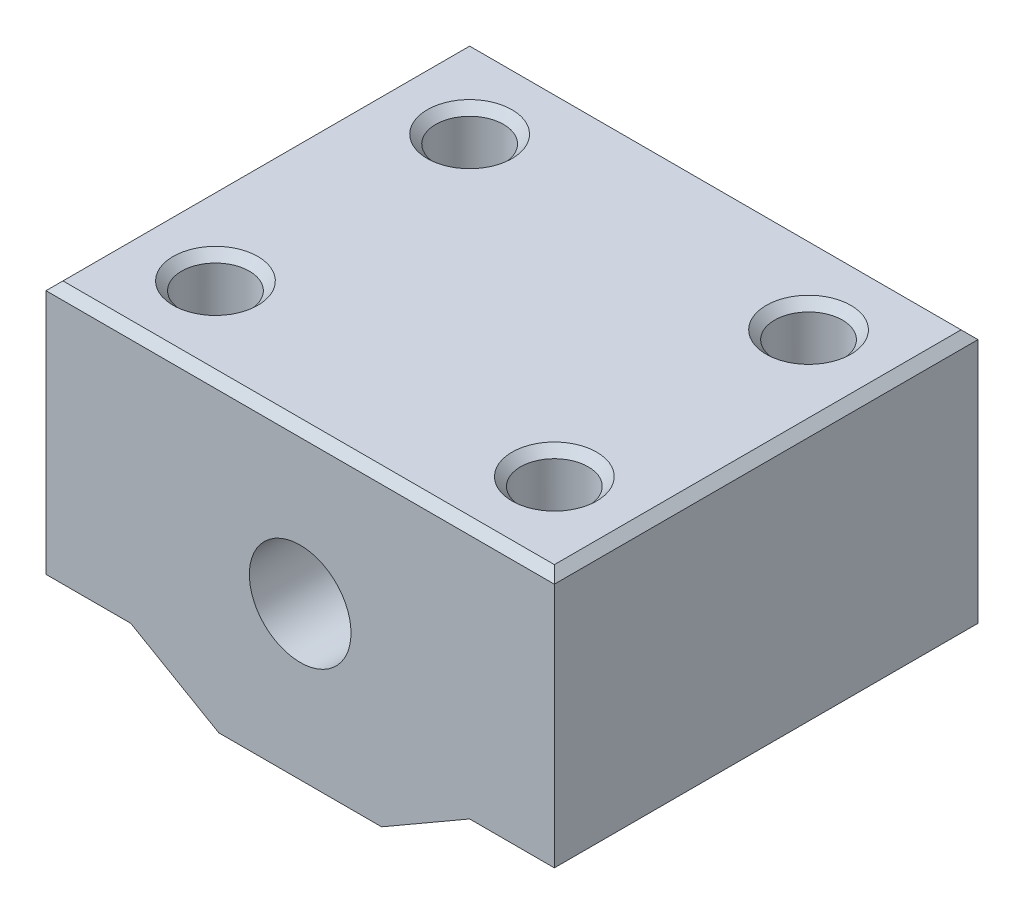
ISO-10303-21;
HEADER;
FILE_DESCRIPTION(('STEP AP214'),'2;1');
FILE_NAME('part.step','',(''),(''),'','','');
FILE_SCHEMA(('AUTOMOTIVE_DESIGN { 1 0 10303 214 1 1 1 1 }'));
ENDSEC;
DATA;
#1=APPLICATION_CONTEXT('core data for automotive mechanical design processes');
#2=APPLICATION_PROTOCOL_DEFINITION('international standard','automotive_design',2000,#1);
#3=PRODUCT_CONTEXT('',#1,'mechanical');
#4=PRODUCT('Part','Part','',(#3));
#5=PRODUCT_RELATED_PRODUCT_CATEGORY('part','',(#4));
#6=PRODUCT_DEFINITION_FORMATION('','',#4);
#7=PRODUCT_DEFINITION_CONTEXT('part definition',#1,'design');
#8=PRODUCT_DEFINITION('design','',#6,#7);
#9=PRODUCT_DEFINITION_SHAPE('','',#8);
#10=(LENGTH_UNIT() NAMED_UNIT(*) SI_UNIT(.MILLI.,.METRE.));
#11=(NAMED_UNIT(*) PLANE_ANGLE_UNIT() SI_UNIT($,.RADIAN.));
#12=(NAMED_UNIT(*) SI_UNIT($,.STERADIAN.) SOLID_ANGLE_UNIT());
#13=UNCERTAINTY_MEASURE_WITH_UNIT(LENGTH_MEASURE(1.E-05),#10,'distance_accuracy_value','');
#14=(GEOMETRIC_REPRESENTATION_CONTEXT(3) GLOBAL_UNCERTAINTY_ASSIGNED_CONTEXT((#13)) GLOBAL_UNIT_ASSIGNED_CONTEXT((#10,
#11,#12)) REPRESENTATION_CONTEXT('',''));
#15=CARTESIAN_POINT('',(0.,0.,0.));
#16=DIRECTION('',(0.,0.,1.));
#17=DIRECTION('',(1.,0.,0.));
#18=AXIS2_PLACEMENT_3D('',#15,#16,#17);
#19=CARTESIAN_POINT('',(15.,-7.5,25.));
#20=DIRECTION('',(-1.,0.,0.));
#21=DIRECTION('',(0.,0.,1.));
#22=AXIS2_PLACEMENT_3D('',#19,#20,#21);
#23=PLANE('',#22);
#24=DIRECTION('',(0.,1.,0.));
#25=VECTOR('',#24,1.);
#26=CARTESIAN_POINT('',(15.,-7.5,0.));
#27=LINE('',#26,#25);
#28=CARTESIAN_POINT('',(15.,-7.5,0.));
#29=VERTEX_POINT('',#28);
#30=CARTESIAN_POINT('',(15.,7.,0.));
#31=VERTEX_POINT('',#30);
#32=EDGE_CURVE('E248',#29,#31,#27,.T.);
#33=ORIENTED_EDGE('',*,*,#32,.T.);
#34=DIRECTION('',(0.,0.,1.));
#35=VECTOR('',#34,1.);
#36=CARTESIAN_POINT('',(15.,7.,25.));
#37=LINE('',#36,#35);
#38=CARTESIAN_POINT('',(15.,7.,25.));
#39=VERTEX_POINT('',#38);
#40=EDGE_CURVE('E205',#31,#39,#37,.T.);
#41=ORIENTED_EDGE('',*,*,#40,.T.);
#42=DIRECTION('',(0.,1.,0.));
#43=VECTOR('',#42,1.);
#44=CARTESIAN_POINT('',(15.,-7.5,25.));
#45=LINE('',#44,#43);
#46=CARTESIAN_POINT('',(15.,-7.5,25.));
#47=VERTEX_POINT('',#46);
#48=EDGE_CURVE('E249',#47,#39,#45,.T.);
#49=ORIENTED_EDGE('',*,*,#48,.F.);
#50=DIRECTION('',(0.,0.,-1.));
#51=VECTOR('',#50,1.);
#52=CARTESIAN_POINT('',(15.,-7.5,25.));
#53=LINE('',#52,#51);
#54=EDGE_CURVE('E161',#47,#29,#53,.T.);
#55=ORIENTED_EDGE('',*,*,#54,.T.);
#56=EDGE_LOOP('',(#33,#41,#49,#55));
#57=FACE_BOUND('',#56,.T.);
#58=ADVANCED_FACE('F32',(#57),#23,.F.);
#59=CARTESIAN_POINT('',(-15.,7.5,25.));
#60=DIRECTION('',(0.,-1.,0.));
#61=DIRECTION('',(0.,0.,-1.));
#62=AXIS2_PLACEMENT_3D('',#59,#60,#61);
#63=PLANE('',#62);
#64=DIRECTION('',(1.,0.,0.));
#65=VECTOR('',#64,1.);
#66=CARTESIAN_POINT('',(-15.,7.5,24.5));
#67=LINE('',#66,#65);
#68=CARTESIAN_POINT('',(-14.5,7.5,24.5));
#69=VERTEX_POINT('',#68);
#70=CARTESIAN_POINT('',(14.5,7.5,24.5));
#71=VERTEX_POINT('',#70);
#72=EDGE_CURVE('E200',#69,#71,#67,.T.);
#73=ORIENTED_EDGE('',*,*,#72,.T.);
#74=DIRECTION('',(0.,0.,-1.));
#75=VECTOR('',#74,1.);
#76=CARTESIAN_POINT('',(14.5,7.5,25.));
#77=LINE('',#76,#75);
#78=CARTESIAN_POINT('',(14.5,7.5,0.500000000000004));
#79=VERTEX_POINT('',#78);
#80=EDGE_CURVE('E202',#71,#79,#77,.T.);
#81=ORIENTED_EDGE('',*,*,#80,.T.);
#82=DIRECTION('',(-1.,0.,0.));
#83=VECTOR('',#82,1.);
#84=CARTESIAN_POINT('',(-15.,7.5,0.500000000000004));
#85=LINE('',#84,#83);
#86=CARTESIAN_POINT('',(-14.5,7.5,0.500000000000004));
#87=VERTEX_POINT('',#86);
#88=EDGE_CURVE('E196',#79,#87,#85,.T.);
#89=ORIENTED_EDGE('',*,*,#88,.T.);
#90=DIRECTION('',(0.,0.,1.));
#91=VECTOR('',#90,1.);
#92=CARTESIAN_POINT('',(-14.5,7.5,25.));
#93=LINE('',#92,#91);
#94=EDGE_CURVE('E198',#87,#69,#93,.T.);
#95=ORIENTED_EDGE('',*,*,#94,.T.);
#96=EDGE_LOOP('',(#73,#81,#89,#95));
#97=FACE_BOUND('',#96,.T.);
#98=CARTESIAN_POINT('',(-10.,7.5,5.));
#99=DIRECTION('',(0.,-1.,0.));
#100=DIRECTION('',(0.,0.,-1.));
#101=AXIS2_PLACEMENT_3D('',#98,#99,#100);
#102=CIRCLE('',#101,2.5);
#103=CARTESIAN_POINT('',(-10.,7.5,2.50000000000001));
#104=VERTEX_POINT('',#103);
#105=EDGE_CURVE('E193',#104,#104,#102,.T.);
#106=ORIENTED_EDGE('',*,*,#105,.T.);
#107=EDGE_LOOP('',(#106));
#108=FACE_BOUND('',#107,.T.);
#109=CARTESIAN_POINT('',(-10.,7.5,20.));
#110=DIRECTION('',(0.,-1.,0.));
#111=DIRECTION('',(0.,0.,-1.));
#112=AXIS2_PLACEMENT_3D('',#109,#110,#111);
#113=CIRCLE('',#112,2.50000000000001);
#114=CARTESIAN_POINT('',(-10.,7.5,17.5));
#115=VERTEX_POINT('',#114);
#116=EDGE_CURVE('E190',#115,#115,#113,.T.);
#117=ORIENTED_EDGE('',*,*,#116,.T.);
#118=EDGE_LOOP('',(#117));
#119=FACE_BOUND('',#118,.T.);
#120=CARTESIAN_POINT('',(10.,7.5,20.));
#121=DIRECTION('',(0.,-1.,0.));
#122=DIRECTION('',(0.,0.,-1.));
#123=AXIS2_PLACEMENT_3D('',#120,#121,#122);
#124=CIRCLE('',#123,2.5);
#125=CARTESIAN_POINT('',(10.,7.5,17.5));
#126=VERTEX_POINT('',#125);
#127=EDGE_CURVE('E187',#126,#126,#124,.T.);
#128=ORIENTED_EDGE('',*,*,#127,.T.);
#129=EDGE_LOOP('',(#128));
#130=FACE_BOUND('',#129,.T.);
#131=CARTESIAN_POINT('',(10.,7.5,5.));
#132=DIRECTION('',(0.,-1.,0.));
#133=DIRECTION('',(0.,0.,-1.));
#134=AXIS2_PLACEMENT_3D('',#131,#132,#133);
#135=CIRCLE('',#134,2.5);
#136=CARTESIAN_POINT('',(10.,7.5,2.5));
#137=VERTEX_POINT('',#136);
#138=EDGE_CURVE('E142',#137,#137,#135,.T.);
#139=ORIENTED_EDGE('',*,*,#138,.T.);
#140=EDGE_LOOP('',(#139));
#141=FACE_BOUND('',#140,.T.);
#142=ADVANCED_FACE('F314',(#97,#108,#119,#130,#141),#63,.F.);
#143=CARTESIAN_POINT('',(-15.,-7.5,25.));
#144=DIRECTION('',(1.,0.,0.));
#145=DIRECTION('',(0.,0.,-1.));
#146=AXIS2_PLACEMENT_3D('',#143,#144,#145);
#147=PLANE('',#146);
#148=DIRECTION('',(0.,-1.,0.));
#149=VECTOR('',#148,1.);
#150=CARTESIAN_POINT('',(-15.,-7.5,25.));
#151=LINE('',#150,#149);
#152=CARTESIAN_POINT('',(-15.,7.,25.));
#153=VERTEX_POINT('',#152);
#154=CARTESIAN_POINT('',(-15.,-7.5,25.));
#155=VERTEX_POINT('',#154);
#156=EDGE_CURVE('E251',#153,#155,#151,.T.);
#157=ORIENTED_EDGE('',*,*,#156,.F.);
#158=DIRECTION('',(0.,0.,-1.));
#159=VECTOR('',#158,1.);
#160=CARTESIAN_POINT('',(-15.,7.,25.));
#161=LINE('',#160,#159);
#162=CARTESIAN_POINT('',(-15.,7.,0.));
#163=VERTEX_POINT('',#162);
#164=EDGE_CURVE('E49',#153,#163,#161,.T.);
#165=ORIENTED_EDGE('',*,*,#164,.T.);
#166=DIRECTION('',(0.,-1.,0.));
#167=VECTOR('',#166,1.);
#168=CARTESIAN_POINT('',(-15.,-7.5,0.));
#169=LINE('',#168,#167);
#170=CARTESIAN_POINT('',(-15.,-7.5,0.));
#171=VERTEX_POINT('',#170);
#172=EDGE_CURVE('E266',#163,#171,#169,.T.);
#173=ORIENTED_EDGE('',*,*,#172,.T.);
#174=DIRECTION('',(0.,0.,-1.));
#175=VECTOR('',#174,1.);
#176=CARTESIAN_POINT('',(-15.,-7.5,25.));
#177=LINE('',#176,#175);
#178=EDGE_CURVE('E174',#155,#171,#177,.T.);
#179=ORIENTED_EDGE('',*,*,#178,.F.);
#180=EDGE_LOOP('',(#157,#165,#173,#179));
#181=FACE_BOUND('',#180,.T.);
#182=ADVANCED_FACE('F320',(#181),#147,.F.);
#183=CARTESIAN_POINT('',(-15.,-7.5,25.));
#184=DIRECTION('',(0.,1.,0.));
#185=DIRECTION('',(-1.,0.,0.));
#186=AXIS2_PLACEMENT_3D('',#183,#184,#185);
#187=PLANE('',#186);
#188=DIRECTION('',(0.,0.,-1.));
#189=VECTOR('',#188,1.);
#190=CARTESIAN_POINT('',(-10.,-7.5,25.));
#191=LINE('',#190,#189);
#192=CARTESIAN_POINT('',(-10.,-7.5,18.));
#193=VERTEX_POINT('',#192);
#194=CARTESIAN_POINT('',(-10.,-7.5,7.));
#195=VERTEX_POINT('',#194);
#196=EDGE_CURVE('E175',#193,#195,#191,.T.);
#197=ORIENTED_EDGE('',*,*,#196,.F.);
#198=CARTESIAN_POINT('',(-10.,-7.5,20.));
#199=DIRECTION('',(0.,1.,0.));
#200=DIRECTION('',(-1.,0.,0.));
#201=AXIS2_PLACEMENT_3D('',#198,#199,#200);
#202=CIRCLE('',#201,2.);
#203=CARTESIAN_POINT('',(-10.,-7.5,22.));
#204=VERTEX_POINT('',#203);
#205=EDGE_CURVE('E242',#193,#204,#202,.T.);
#206=ORIENTED_EDGE('',*,*,#205,.T.);
#207=CARTESIAN_POINT('',(-10.,-7.5,25.));
#208=VERTEX_POINT('',#207);
#209=EDGE_CURVE('E171',#208,#204,#191,.T.);
#210=ORIENTED_EDGE('',*,*,#209,.F.);
#211=DIRECTION('',(1.,0.,0.));
#212=VECTOR('',#211,1.);
#213=CARTESIAN_POINT('',(-15.,-7.5,25.));
#214=LINE('',#213,#212);
#215=EDGE_CURVE('E254',#155,#208,#214,.T.);
#216=ORIENTED_EDGE('',*,*,#215,.F.);
#217=ORIENTED_EDGE('',*,*,#178,.T.);
#218=DIRECTION('',(1.,0.,0.));
#219=VECTOR('',#218,1.);
#220=CARTESIAN_POINT('',(-15.,-7.5,0.));
#221=LINE('',#220,#219);
#222=CARTESIAN_POINT('',(-10.,-7.5,0.));
#223=VERTEX_POINT('',#222);
#224=EDGE_CURVE('E268',#171,#223,#221,.T.);
#225=ORIENTED_EDGE('',*,*,#224,.T.);
#226=CARTESIAN_POINT('',(-10.,-7.5,3.));
#227=VERTEX_POINT('',#226);
#228=EDGE_CURVE('E170',#227,#223,#191,.T.);
#229=ORIENTED_EDGE('',*,*,#228,.F.);
#230=CARTESIAN_POINT('',(-10.,-7.5,5.));
#231=DIRECTION('',(0.,1.,0.));
#232=DIRECTION('',(-1.,0.,0.));
#233=AXIS2_PLACEMENT_3D('',#230,#231,#232);
#234=CIRCLE('',#233,2.);
#235=EDGE_CURVE('E245',#227,#195,#234,.T.);
#236=ORIENTED_EDGE('',*,*,#235,.T.);
#237=EDGE_LOOP('',(#197,#206,#210,#216,#217,#225,#229,#236));
#238=FACE_BOUND('',#237,.T.);
#239=ADVANCED_FACE('F448',(#238),#187,.F.);
#240=CARTESIAN_POINT('',(-10.,-7.5,25.));
#241=DIRECTION('',(0.500000000000001,0.866025403784438,0.));
#242=DIRECTION('',(-0.866025403784438,0.500000000000001,0.));
#243=AXIS2_PLACEMENT_3D('',#240,#241,#242);
#244=PLANE('',#243);
#245=ORIENTED_EDGE('',*,*,#209,.T.);
#246=CARTESIAN_POINT('',(-10.,-7.5,20.));
#247=DIRECTION('',(0.500000000000001,0.866025403784438,0.));
#248=DIRECTION('',(-0.866025403784438,0.500000000000001,0.));
#249=AXIS2_PLACEMENT_3D('',#246,#247,#248);
#250=ELLIPSE('',#249,2.30940107675851,2.);
#251=EDGE_CURVE('E181',#204,#193,#250,.T.);
#252=ORIENTED_EDGE('',*,*,#251,.T.);
#253=ORIENTED_EDGE('',*,*,#196,.T.);
#254=CARTESIAN_POINT('',(-10.,-7.5,5.));
#255=DIRECTION('',(0.500000000000001,0.866025403784438,0.));
#256=DIRECTION('',(-0.866025403784438,0.500000000000001,0.));
#257=AXIS2_PLACEMENT_3D('',#254,#255,#256);
#258=ELLIPSE('',#257,2.3094010767585,2.);
#259=EDGE_CURVE('E178',#195,#227,#258,.T.);
#260=ORIENTED_EDGE('',*,*,#259,.T.);
#261=ORIENTED_EDGE('',*,*,#228,.T.);
#262=DIRECTION('',(0.866025403784438,-0.500000000000001,0.));
#263=VECTOR('',#262,1.);
#264=CARTESIAN_POINT('',(-10.,-7.5,0.));
#265=LINE('',#264,#263);
#266=CARTESIAN_POINT('',(-4.80384757729338,-10.5,0.));
#267=VERTEX_POINT('',#266);
#268=EDGE_CURVE('E271',#223,#267,#265,.T.);
#269=ORIENTED_EDGE('',*,*,#268,.T.);
#270=DIRECTION('',(0.,0.,-1.));
#271=VECTOR('',#270,1.);
#272=CARTESIAN_POINT('',(-4.80384757729338,-10.5,25.));
#273=LINE('',#272,#271);
#274=CARTESIAN_POINT('',(-4.80384757729338,-10.5,25.));
#275=VERTEX_POINT('',#274);
#276=EDGE_CURVE('E167',#275,#267,#273,.T.);
#277=ORIENTED_EDGE('',*,*,#276,.F.);
#278=DIRECTION('',(0.866025403784438,-0.500000000000001,0.));
#279=VECTOR('',#278,1.);
#280=CARTESIAN_POINT('',(-10.,-7.5,25.));
#281=LINE('',#280,#279);
#282=EDGE_CURVE('E256',#208,#275,#281,.T.);
#283=ORIENTED_EDGE('',*,*,#282,.F.);
#284=EDGE_LOOP('',(#245,#252,#253,#260,#261,#269,#277,#283));
#285=FACE_BOUND('',#284,.T.);
#286=ADVANCED_FACE('F443',(#285),#244,.F.);
#287=CARTESIAN_POINT('',(-4.80384757729338,-10.5,25.));
#288=DIRECTION('',(0.,1.,0.));
#289=DIRECTION('',(-1.,0.,0.));
#290=AXIS2_PLACEMENT_3D('',#287,#288,#289);
#291=PLANE('',#290);
#292=DIRECTION('',(1.,0.,0.));
#293=VECTOR('',#292,1.);
#294=CARTESIAN_POINT('',(-4.80384757729338,-10.5,0.));
#295=LINE('',#294,#293);
#296=CARTESIAN_POINT('',(4.80384757729339,-10.5,0.));
#297=VERTEX_POINT('',#296);
#298=EDGE_CURVE('E273',#267,#297,#295,.T.);
#299=ORIENTED_EDGE('',*,*,#298,.T.);
#300=DIRECTION('',(0.,0.,-1.));
#301=VECTOR('',#300,1.);
#302=CARTESIAN_POINT('',(4.80384757729339,-10.5,25.));
#303=LINE('',#302,#301);
#304=CARTESIAN_POINT('',(4.80384757729339,-10.5,25.));
#305=VERTEX_POINT('',#304);
#306=EDGE_CURVE('E160',#305,#297,#303,.T.);
#307=ORIENTED_EDGE('',*,*,#306,.F.);
#308=DIRECTION('',(1.,0.,0.));
#309=VECTOR('',#308,1.);
#310=CARTESIAN_POINT('',(-4.80384757729338,-10.5,25.));
#311=LINE('',#310,#309);
#312=EDGE_CURVE('E258',#275,#305,#311,.T.);
#313=ORIENTED_EDGE('',*,*,#312,.F.);
#314=ORIENTED_EDGE('',*,*,#276,.T.);
#315=EDGE_LOOP('',(#299,#307,#313,#314));
#316=FACE_BOUND('',#315,.T.);
#317=ADVANCED_FACE('F436',(#316),#291,.F.);
#318=CARTESIAN_POINT('',(10.,-7.5,25.));
#319=DIRECTION('',(-0.500000000000001,0.866025403784438,0.));
#320=DIRECTION('',(-0.866025403784438,-0.500000000000001,0.));
#321=AXIS2_PLACEMENT_3D('',#318,#319,#320);
#322=PLANE('',#321);
#323=CARTESIAN_POINT('',(10.,-7.5,5.));
#324=DIRECTION('',(-0.500000000000001,0.866025403784438,0.));
#325=DIRECTION('',(0.866025403784438,0.500000000000001,0.));
#326=AXIS2_PLACEMENT_3D('',#323,#324,#325);
#327=ELLIPSE('',#326,2.3094010767585,2.);
#328=CARTESIAN_POINT('',(10.,-7.5,7.));
#329=VERTEX_POINT('',#328);
#330=CARTESIAN_POINT('',(10.,-7.5,3.));
#331=VERTEX_POINT('',#330);
#332=EDGE_CURVE('E138',#329,#331,#327,.F.);
#333=ORIENTED_EDGE('',*,*,#332,.F.);
#334=DIRECTION('',(0.,0.,-1.));
#335=VECTOR('',#334,1.);
#336=CARTESIAN_POINT('',(10.,-7.5,25.));
#337=LINE('',#336,#335);
#338=CARTESIAN_POINT('',(10.,-7.5,18.));
#339=VERTEX_POINT('',#338);
#340=EDGE_CURVE('E149',#339,#329,#337,.T.);
#341=ORIENTED_EDGE('',*,*,#340,.F.);
#342=CARTESIAN_POINT('',(10.,-7.5,20.));
#343=DIRECTION('',(-0.500000000000001,0.866025403784438,0.));
#344=DIRECTION('',(0.866025403784438,0.500000000000001,0.));
#345=AXIS2_PLACEMENT_3D('',#342,#343,#344);
#346=ELLIPSE('',#345,2.30940107675851,2.);
#347=CARTESIAN_POINT('',(10.,-7.5,22.));
#348=VERTEX_POINT('',#347);
#349=EDGE_CURVE('E152',#348,#339,#346,.F.);
#350=ORIENTED_EDGE('',*,*,#349,.F.);
#351=CARTESIAN_POINT('',(10.,-7.5,25.));
#352=VERTEX_POINT('',#351);
#353=EDGE_CURVE('E158',#352,#348,#337,.T.);
#354=ORIENTED_EDGE('',*,*,#353,.F.);
#355=DIRECTION('',(0.866025403784438,0.500000000000001,0.));
#356=VECTOR('',#355,1.);
#357=CARTESIAN_POINT('',(10.,-7.5,25.));
#358=LINE('',#357,#356);
#359=EDGE_CURVE('E260',#305,#352,#358,.T.);
#360=ORIENTED_EDGE('',*,*,#359,.F.);
#361=ORIENTED_EDGE('',*,*,#306,.T.);
#362=DIRECTION('',(0.866025403784438,0.500000000000001,0.));
#363=VECTOR('',#362,1.);
#364=CARTESIAN_POINT('',(10.,-7.5,0.));
#365=LINE('',#364,#363);
#366=CARTESIAN_POINT('',(10.,-7.5,0.));
#367=VERTEX_POINT('',#366);
#368=EDGE_CURVE('E275',#297,#367,#365,.T.);
#369=ORIENTED_EDGE('',*,*,#368,.T.);
#370=EDGE_CURVE('E151',#331,#367,#337,.T.);
#371=ORIENTED_EDGE('',*,*,#370,.F.);
#372=EDGE_LOOP('',(#333,#341,#350,#354,#360,#361,#369,#371));
#373=FACE_BOUND('',#372,.T.);
#374=ADVANCED_FACE('F147',(#373),#322,.F.);
#375=CARTESIAN_POINT('',(10.,-7.5,25.));
#376=DIRECTION('',(0.,1.,0.));
#377=DIRECTION('',(-1.,0.,0.));
#378=AXIS2_PLACEMENT_3D('',#375,#376,#377);
#379=PLANE('',#378);
#380=CARTESIAN_POINT('',(10.,-7.5,5.));
#381=DIRECTION('',(0.,1.,0.));
#382=DIRECTION('',(-1.,0.,0.));
#383=AXIS2_PLACEMENT_3D('',#380,#381,#382);
#384=CIRCLE('',#383,2.);
#385=EDGE_CURVE('E135',#331,#329,#384,.F.);
#386=ORIENTED_EDGE('',*,*,#385,.F.);
#387=ORIENTED_EDGE('',*,*,#370,.T.);
#388=DIRECTION('',(1.,0.,0.));
#389=VECTOR('',#388,1.);
#390=CARTESIAN_POINT('',(10.,-7.5,0.));
#391=LINE('',#390,#389);
#392=EDGE_CURVE('E252',#367,#29,#391,.T.);
#393=ORIENTED_EDGE('',*,*,#392,.T.);
#394=ORIENTED_EDGE('',*,*,#54,.F.);
#395=DIRECTION('',(1.,0.,0.));
#396=VECTOR('',#395,1.);
#397=CARTESIAN_POINT('',(10.,-7.5,25.));
#398=LINE('',#397,#396);
#399=EDGE_CURVE('E262',#352,#47,#398,.T.);
#400=ORIENTED_EDGE('',*,*,#399,.F.);
#401=ORIENTED_EDGE('',*,*,#353,.T.);
#402=CARTESIAN_POINT('',(10.,-7.5,20.));
#403=DIRECTION('',(0.,1.,0.));
#404=DIRECTION('',(-1.,0.,0.));
#405=AXIS2_PLACEMENT_3D('',#402,#403,#404);
#406=CIRCLE('',#405,2.);
#407=EDGE_CURVE('E143',#339,#348,#406,.F.);
#408=ORIENTED_EDGE('',*,*,#407,.F.);
#409=ORIENTED_EDGE('',*,*,#340,.T.);
#410=EDGE_LOOP('',(#386,#387,#393,#394,#400,#401,#408,#409));
#411=FACE_BOUND('',#410,.T.);
#412=ADVANCED_FACE('F156',(#411),#379,.F.);
#413=CARTESIAN_POINT('',(0.,0.,25.));
#414=DIRECTION('',(0.,0.,-1.));
#415=DIRECTION('',(-1.,0.,0.));
#416=AXIS2_PLACEMENT_3D('',#413,#414,#415);
#417=PLANE('',#416);
#418=CARTESIAN_POINT('',(0.,-1.5,25.));
#419=DIRECTION('',(0.,0.,1.));
#420=DIRECTION('',(1.,0.,0.));
#421=AXIS2_PLACEMENT_3D('',#418,#419,#420);
#422=CIRCLE('',#421,3.);
#423=CARTESIAN_POINT('',(3.,-1.5,25.));
#424=VERTEX_POINT('',#423);
#425=EDGE_CURVE('E230',#424,#424,#422,.T.);
#426=ORIENTED_EDGE('',*,*,#425,.F.);
#427=EDGE_LOOP('',(#426));
#428=FACE_BOUND('',#427,.T.);
#429=ORIENTED_EDGE('',*,*,#48,.T.);
#430=DIRECTION('',(-1.,0.,0.));
#431=VECTOR('',#430,1.);
#432=CARTESIAN_POINT('',(0.,7.,25.));
#433=LINE('',#432,#431);
#434=EDGE_CURVE('E57',#39,#153,#433,.T.);
#435=ORIENTED_EDGE('',*,*,#434,.T.);
#436=ORIENTED_EDGE('',*,*,#156,.T.);
#437=ORIENTED_EDGE('',*,*,#215,.T.);
#438=ORIENTED_EDGE('',*,*,#282,.T.);
#439=ORIENTED_EDGE('',*,*,#312,.T.);
#440=ORIENTED_EDGE('',*,*,#359,.T.);
#441=ORIENTED_EDGE('',*,*,#399,.T.);
#442=EDGE_LOOP('',(#429,#435,#436,#437,#438,#439,#440,#441));
#443=FACE_BOUND('',#442,.T.);
#444=ADVANCED_FACE('F294',(#428,#443),#417,.F.);
#445=CARTESIAN_POINT('',(0.,0.,0.));
#446=DIRECTION('',(0.,0.,-1.));
#447=DIRECTION('',(-1.,0.,0.));
#448=AXIS2_PLACEMENT_3D('',#445,#446,#447);
#449=PLANE('',#448);
#450=CARTESIAN_POINT('',(0.,-1.5,0.));
#451=DIRECTION('',(0.,0.,1.));
#452=DIRECTION('',(1.,0.,0.));
#453=AXIS2_PLACEMENT_3D('',#450,#451,#452);
#454=CIRCLE('',#453,3.);
#455=CARTESIAN_POINT('',(3.,-1.5,0.));
#456=VERTEX_POINT('',#455);
#457=EDGE_CURVE('E153',#456,#456,#454,.T.);
#458=ORIENTED_EDGE('',*,*,#457,.T.);
#459=EDGE_LOOP('',(#458));
#460=FACE_BOUND('',#459,.T.);
#461=ORIENTED_EDGE('',*,*,#172,.F.);
#462=DIRECTION('',(1.,0.,0.));
#463=VECTOR('',#462,1.);
#464=CARTESIAN_POINT('',(15.,7.,0.));
#465=LINE('',#464,#463);
#466=EDGE_CURVE('E210',#163,#31,#465,.T.);
#467=ORIENTED_EDGE('',*,*,#466,.T.);
#468=ORIENTED_EDGE('',*,*,#32,.F.);
#469=ORIENTED_EDGE('',*,*,#392,.F.);
#470=ORIENTED_EDGE('',*,*,#368,.F.);
#471=ORIENTED_EDGE('',*,*,#298,.F.);
#472=ORIENTED_EDGE('',*,*,#268,.F.);
#473=ORIENTED_EDGE('',*,*,#224,.F.);
#474=EDGE_LOOP('',(#461,#467,#468,#469,#470,#471,#472,#473));
#475=FACE_BOUND('',#474,.T.);
#476=ADVANCED_FACE('F286',(#460,#475),#449,.T.);
#477=CARTESIAN_POINT('',(-10.,-10.5,5.));
#478=DIRECTION('',(0.,1.,0.));
#479=DIRECTION('',(0.,0.,1.));
#480=AXIS2_PLACEMENT_3D('',#477,#478,#479);
#481=CYLINDRICAL_SURFACE('',#480,2.);
#482=CARTESIAN_POINT('',(-10.,7.,5.));
#483=DIRECTION('',(0.,-1.,0.));
#484=DIRECTION('',(0.,0.,-1.));
#485=AXIS2_PLACEMENT_3D('',#482,#483,#484);
#486=CIRCLE('',#485,2.);
#487=CARTESIAN_POINT('',(-10.,7.,3.));
#488=VERTEX_POINT('',#487);
#489=EDGE_CURVE('E212',#488,#488,#486,.F.);
#490=ORIENTED_EDGE('',*,*,#489,.T.);
#491=EDGE_LOOP('',(#490));
#492=FACE_BOUND('',#491,.T.);
#493=ORIENTED_EDGE('',*,*,#259,.F.);
#494=ORIENTED_EDGE('',*,*,#235,.F.);
#495=EDGE_LOOP('',(#493,#494));
#496=FACE_BOUND('',#495,.T.);
#497=ADVANCED_FACE('F310',(#492,#496),#481,.F.);
#498=CARTESIAN_POINT('',(-10.,-10.5,20.));
#499=DIRECTION('',(0.,1.,0.));
#500=DIRECTION('',(0.,0.,1.));
#501=AXIS2_PLACEMENT_3D('',#498,#499,#500);
#502=CYLINDRICAL_SURFACE('',#501,2.);
#503=CARTESIAN_POINT('',(-10.,7.,20.));
#504=DIRECTION('',(0.,-1.,0.));
#505=DIRECTION('',(0.,0.,-1.));
#506=AXIS2_PLACEMENT_3D('',#503,#504,#505);
#507=CIRCLE('',#506,2.);
#508=CARTESIAN_POINT('',(-10.,7.,18.));
#509=VERTEX_POINT('',#508);
#510=EDGE_CURVE('E215',#509,#509,#507,.F.);
#511=ORIENTED_EDGE('',*,*,#510,.T.);
#512=EDGE_LOOP('',(#511));
#513=FACE_BOUND('',#512,.T.);
#514=ORIENTED_EDGE('',*,*,#251,.F.);
#515=ORIENTED_EDGE('',*,*,#205,.F.);
#516=EDGE_LOOP('',(#514,#515));
#517=FACE_BOUND('',#516,.T.);
#518=ADVANCED_FACE('F300',(#513,#517),#502,.F.);
#519=CARTESIAN_POINT('',(10.,-10.5,20.));
#520=DIRECTION('',(0.,1.,0.));
#521=DIRECTION('',(0.,0.,1.));
#522=AXIS2_PLACEMENT_3D('',#519,#520,#521);
#523=CYLINDRICAL_SURFACE('',#522,2.);
#524=CARTESIAN_POINT('',(10.,7.,20.));
#525=DIRECTION('',(0.,-1.,0.));
#526=DIRECTION('',(0.,0.,-1.));
#527=AXIS2_PLACEMENT_3D('',#524,#525,#526);
#528=CIRCLE('',#527,2.);
#529=CARTESIAN_POINT('',(10.,7.,18.));
#530=VERTEX_POINT('',#529);
#531=EDGE_CURVE('E41',#530,#530,#528,.F.);
#532=ORIENTED_EDGE('',*,*,#531,.T.);
#533=EDGE_LOOP('',(#532));
#534=FACE_BOUND('',#533,.T.);
#535=ORIENTED_EDGE('',*,*,#349,.T.);
#536=ORIENTED_EDGE('',*,*,#407,.T.);
#537=EDGE_LOOP('',(#535,#536));
#538=FACE_BOUND('',#537,.T.);
#539=ADVANCED_FACE('F298',(#534,#538),#523,.F.);
#540=CARTESIAN_POINT('',(10.,-10.5,5.));
#541=DIRECTION('',(0.,1.,0.));
#542=DIRECTION('',(0.,0.,1.));
#543=AXIS2_PLACEMENT_3D('',#540,#541,#542);
#544=CYLINDRICAL_SURFACE('',#543,2.);
#545=CARTESIAN_POINT('',(10.,6.99999999999999,5.));
#546=DIRECTION('',(0.,-1.,0.));
#547=DIRECTION('',(0.,0.,-1.));
#548=AXIS2_PLACEMENT_3D('',#545,#546,#547);
#549=CIRCLE('',#548,2.);
#550=CARTESIAN_POINT('',(10.,6.99999999999999,3.));
#551=VERTEX_POINT('',#550);
#552=EDGE_CURVE('E11',#551,#551,#549,.F.);
#553=ORIENTED_EDGE('',*,*,#552,.T.);
#554=EDGE_LOOP('',(#553));
#555=FACE_BOUND('',#554,.T.);
#556=ORIENTED_EDGE('',*,*,#332,.T.);
#557=ORIENTED_EDGE('',*,*,#385,.T.);
#558=EDGE_LOOP('',(#556,#557));
#559=FACE_BOUND('',#558,.T.);
#560=ADVANCED_FACE('F137',(#555,#559),#544,.F.);
#561=CARTESIAN_POINT('',(0.,-1.5,0.));
#562=DIRECTION('',(0.,0.,1.));
#563=DIRECTION('',(1.,0.,0.));
#564=AXIS2_PLACEMENT_3D('',#561,#562,#563);
#565=CYLINDRICAL_SURFACE('',#564,3.);
#566=ORIENTED_EDGE('',*,*,#457,.F.);
#567=EDGE_LOOP('',(#566));
#568=FACE_BOUND('',#567,.T.);
#569=ORIENTED_EDGE('',*,*,#425,.T.);
#570=EDGE_LOOP('',(#569));
#571=FACE_BOUND('',#570,.T.);
#572=ADVANCED_FACE('F307',(#568,#571),#565,.F.);
#573=CARTESIAN_POINT('',(-15.,7.,25.));
#574=DIRECTION('',(0.707106781186547,-0.707106781186547,0.));
#575=DIRECTION('',(0.,0.,-1.));
#576=AXIS2_PLACEMENT_3D('',#573,#574,#575);
#577=PLANE('',#576);
#578=DIRECTION('',(-0.577350269189626,-0.577350269189626,-0.577350269189626));
#579=VECTOR('',#578,1.);
#580=CARTESIAN_POINT('',(-14.6666666666667,7.33333333333333,0.333333333333336));
#581=LINE('',#580,#579);
#582=EDGE_CURVE('E223',#163,#87,#581,.F.);
#583=ORIENTED_EDGE('',*,*,#582,.F.);
#584=ORIENTED_EDGE('',*,*,#164,.F.);
#585=DIRECTION('',(0.577350269189626,0.577350269189626,-0.577350269189626));
#586=VECTOR('',#585,1.);
#587=CARTESIAN_POINT('',(-15.,7.,25.));
#588=LINE('',#587,#586);
#589=EDGE_CURVE('E36',#69,#153,#588,.F.);
#590=ORIENTED_EDGE('',*,*,#589,.F.);
#591=ORIENTED_EDGE('',*,*,#94,.F.);
#592=EDGE_LOOP('',(#583,#584,#590,#591));
#593=FACE_BOUND('',#592,.T.);
#594=ADVANCED_FACE('F333',(#593),#577,.F.);
#595=CARTESIAN_POINT('',(0.,7.,25.));
#596=DIRECTION('',(0.,-0.707106781186547,-0.707106781186547));
#597=DIRECTION('',(-1.,0.,0.));
#598=AXIS2_PLACEMENT_3D('',#595,#596,#597);
#599=PLANE('',#598);
#600=ORIENTED_EDGE('',*,*,#589,.T.);
#601=ORIENTED_EDGE('',*,*,#434,.F.);
#602=DIRECTION('',(-0.577350269189626,0.577350269189626,-0.577350269189626));
#603=VECTOR('',#602,1.);
#604=CARTESIAN_POINT('',(10.,12.,20.));
#605=LINE('',#604,#603);
#606=EDGE_CURVE('E222',#71,#39,#605,.F.);
#607=ORIENTED_EDGE('',*,*,#606,.F.);
#608=ORIENTED_EDGE('',*,*,#72,.F.);
#609=EDGE_LOOP('',(#600,#601,#607,#608));
#610=FACE_BOUND('',#609,.T.);
#611=ADVANCED_FACE('F330',(#610),#599,.F.);
#612=CARTESIAN_POINT('',(-15.,7.5,0.500000000000004));
#613=DIRECTION('',(0.,0.707106781186547,-0.707106781186547));
#614=DIRECTION('',(1.,0.,0.));
#615=AXIS2_PLACEMENT_3D('',#612,#613,#614);
#616=PLANE('',#615);
#617=ORIENTED_EDGE('',*,*,#582,.T.);
#618=ORIENTED_EDGE('',*,*,#88,.F.);
#619=DIRECTION('',(-0.577350269189626,0.577350269189626,0.577350269189626));
#620=VECTOR('',#619,1.);
#621=CARTESIAN_POINT('',(4.66666666666666,17.3333333333333,10.3333333333333));
#622=LINE('',#621,#620);
#623=EDGE_CURVE('E220',#31,#79,#622,.T.);
#624=ORIENTED_EDGE('',*,*,#623,.F.);
#625=ORIENTED_EDGE('',*,*,#466,.F.);
#626=EDGE_LOOP('',(#617,#618,#624,#625));
#627=FACE_BOUND('',#626,.T.);
#628=ADVANCED_FACE('F289',(#627),#616,.T.);
#629=CARTESIAN_POINT('',(14.5,7.5,25.));
#630=DIRECTION('',(-0.707106781186547,-0.707106781186547,0.));
#631=DIRECTION('',(0.,0.,-1.));
#632=AXIS2_PLACEMENT_3D('',#629,#630,#631);
#633=PLANE('',#632);
#634=ORIENTED_EDGE('',*,*,#606,.T.);
#635=ORIENTED_EDGE('',*,*,#40,.F.);
#636=ORIENTED_EDGE('',*,*,#623,.T.);
#637=ORIENTED_EDGE('',*,*,#80,.F.);
#638=EDGE_LOOP('',(#634,#635,#636,#637));
#639=FACE_BOUND('',#638,.T.);
#640=ADVANCED_FACE('F292',(#639),#633,.F.);
#641=CARTESIAN_POINT('',(-10.,7.,5.));
#642=DIRECTION('',(0.,1.,0.));
#643=DIRECTION('',(0.,0.,1.));
#644=AXIS2_PLACEMENT_3D('',#641,#642,#643);
#645=CONICAL_SURFACE('',#644,2.,0.785398163397447);
#646=ORIENTED_EDGE('',*,*,#105,.F.);
#647=EDGE_LOOP('',(#646));
#648=FACE_BOUND('',#647,.T.);
#649=ORIENTED_EDGE('',*,*,#489,.F.);
#650=EDGE_LOOP('',(#649));
#651=FACE_BOUND('',#650,.T.);
#652=ADVANCED_FACE('F327',(#648,#651),#645,.F.);
#653=CARTESIAN_POINT('',(-10.,7.,20.));
#654=DIRECTION('',(0.,1.,0.));
#655=DIRECTION('',(0.,0.,1.));
#656=AXIS2_PLACEMENT_3D('',#653,#654,#655);
#657=CONICAL_SURFACE('',#656,2.,0.785398163397455);
#658=ORIENTED_EDGE('',*,*,#116,.F.);
#659=EDGE_LOOP('',(#658));
#660=FACE_BOUND('',#659,.T.);
#661=ORIENTED_EDGE('',*,*,#510,.F.);
#662=EDGE_LOOP('',(#661));
#663=FACE_BOUND('',#662,.T.);
#664=ADVANCED_FACE('F339',(#660,#663),#657,.F.);
#665=CARTESIAN_POINT('',(10.,7.5,20.));
#666=DIRECTION('',(0.,1.,0.));
#667=DIRECTION('',(0.,0.,1.));
#668=AXIS2_PLACEMENT_3D('',#665,#666,#667);
#669=CONICAL_SURFACE('',#668,2.5,0.785398163397445);
#670=ORIENTED_EDGE('',*,*,#531,.F.);
#671=EDGE_LOOP('',(#670));
#672=FACE_BOUND('',#671,.T.);
#673=ORIENTED_EDGE('',*,*,#127,.F.);
#674=EDGE_LOOP('',(#673));
#675=FACE_BOUND('',#674,.T.);
#676=ADVANCED_FACE('F342',(#672,#675),#669,.F.);
#677=CARTESIAN_POINT('',(10.,7.5,5.));
#678=DIRECTION('',(0.,1.,0.));
#679=DIRECTION('',(0.,0.,1.));
#680=AXIS2_PLACEMENT_3D('',#677,#678,#679);
#681=CONICAL_SURFACE('',#680,2.5,0.785398163397445);
#682=ORIENTED_EDGE('',*,*,#552,.F.);
#683=EDGE_LOOP('',(#682));
#684=FACE_BOUND('',#683,.T.);
#685=ORIENTED_EDGE('',*,*,#138,.F.);
#686=EDGE_LOOP('',(#685));
#687=FACE_BOUND('',#686,.T.);
#688=ADVANCED_FACE('F34',(#684,#687),#681,.F.);
#689=CLOSED_SHELL('',(#58,#142,#182,#239,#286,#317,#374,#412,#444,#476,#497,#518,#539,#560,#572,
#594,#611,#628,#640,#652,#664,#676,#688));
#690=MANIFOLD_SOLID_BREP('B2',#689);
#691=ADVANCED_BREP_SHAPE_REPRESENTATION('',(#18,#690),#14);
#692=SHAPE_DEFINITION_REPRESENTATION(#9,#691);
ENDSEC;
END-ISO-10303-21;
